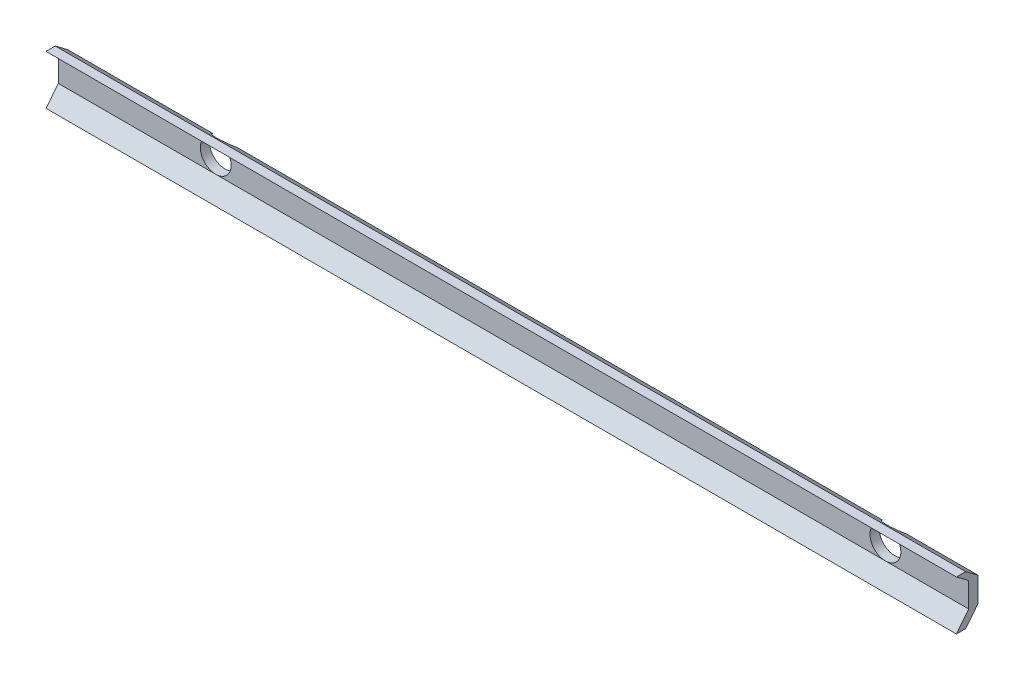
ISO-10303-21;
HEADER;
FILE_DESCRIPTION(('STEP AP214'),'2;1');
FILE_NAME('part.step','',(''),(''),'','','');
FILE_SCHEMA(('AUTOMOTIVE_DESIGN { 1 0 10303 214 1 1 1 1 }'));
ENDSEC;
DATA;
#1=APPLICATION_CONTEXT('core data for automotive mechanical design processes');
#2=APPLICATION_PROTOCOL_DEFINITION('international standard','automotive_design',2000,#1);
#3=PRODUCT_CONTEXT('',#1,'mechanical');
#4=PRODUCT('Part','Part','',(#3));
#5=PRODUCT_RELATED_PRODUCT_CATEGORY('part','',(#4));
#6=PRODUCT_DEFINITION_FORMATION('','',#4);
#7=PRODUCT_DEFINITION_CONTEXT('part definition',#1,'design');
#8=PRODUCT_DEFINITION('design','',#6,#7);
#9=PRODUCT_DEFINITION_SHAPE('','',#8);
#10=(LENGTH_UNIT() NAMED_UNIT(*) SI_UNIT(.MILLI.,.METRE.));
#11=(NAMED_UNIT(*) PLANE_ANGLE_UNIT() SI_UNIT($,.RADIAN.));
#12=(NAMED_UNIT(*) SI_UNIT($,.STERADIAN.) SOLID_ANGLE_UNIT());
#13=UNCERTAINTY_MEASURE_WITH_UNIT(LENGTH_MEASURE(1.E-05),#10,'distance_accuracy_value','');
#14=(GEOMETRIC_REPRESENTATION_CONTEXT(3) GLOBAL_UNCERTAINTY_ASSIGNED_CONTEXT((#13)) GLOBAL_UNIT_ASSIGNED_CONTEXT((#10,
#11,#12)) REPRESENTATION_CONTEXT('',''));
#15=CARTESIAN_POINT('',(0.,0.,0.));
#16=DIRECTION('',(0.,0.,1.));
#17=DIRECTION('',(1.,0.,0.));
#18=AXIS2_PLACEMENT_3D('',#15,#16,#17);
#19=CARTESIAN_POINT('',(-147.5,-1.5,-2.));
#20=DIRECTION('',(0.,0.,1.));
#21=DIRECTION('',(1.,0.,0.));
#22=AXIS2_PLACEMENT_3D('',#19,#20,#21);
#23=PLANE('',#22);
#24=CARTESIAN_POINT('',(-122.,-3.,-2.));
#25=DIRECTION('',(0.,0.,1.));
#26=DIRECTION('',(1.,0.,0.));
#27=AXIS2_PLACEMENT_3D('',#24,#25,#26);
#28=CIRCLE('',#27,2.49999999999999);
#29=CARTESIAN_POINT('',(-124.,-1.5,-2.));
#30=VERTEX_POINT('',#29);
#31=CARTESIAN_POINT('',(-122.,-5.5,-2.));
#32=VERTEX_POINT('',#31);
#33=EDGE_CURVE('E135',#30,#32,#28,.T.);
#34=ORIENTED_EDGE('',*,*,#33,.F.);
#35=DIRECTION('',(1.,0.,0.));
#36=VECTOR('',#35,1.);
#37=CARTESIAN_POINT('',(-147.5,-1.5,-2.));
#38=LINE('',#37,#36);
#39=CARTESIAN_POINT('',(-147.5,-1.5,-2.));
#40=VERTEX_POINT('',#39);
#41=EDGE_CURVE('E169',#40,#30,#38,.T.);
#42=ORIENTED_EDGE('',*,*,#41,.F.);
#43=DIRECTION('',(0.,-1.,0.));
#44=VECTOR('',#43,1.);
#45=CARTESIAN_POINT('',(-147.5,-1.5,-2.));
#46=LINE('',#45,#44);
#47=CARTESIAN_POINT('',(-147.5,-5.5,-2.));
#48=VERTEX_POINT('',#47);
#49=EDGE_CURVE('E232',#40,#48,#46,.T.);
#50=ORIENTED_EDGE('',*,*,#49,.T.);
#51=DIRECTION('',(1.,0.,0.));
#52=VECTOR('',#51,1.);
#53=CARTESIAN_POINT('',(-147.5,-5.5,-2.));
#54=LINE('',#53,#52);
#55=EDGE_CURVE('E164',#48,#32,#54,.T.);
#56=ORIENTED_EDGE('',*,*,#55,.T.);
#57=EDGE_LOOP('',(#34,#42,#50,#56));
#58=FACE_BOUND('',#57,.T.);
#59=ADVANCED_FACE('F30',(#58),#23,.T.);
#60=CARTESIAN_POINT('',(-147.5,-1.5,-3.5));
#61=DIRECTION('',(0.,0.,-1.));
#62=DIRECTION('',(0.,1.,0.));
#63=AXIS2_PLACEMENT_3D('',#60,#61,#62);
#64=PLANE('',#63);
#65=CARTESIAN_POINT('',(-122.,-3.,-3.5));
#66=DIRECTION('',(0.,0.,-1.));
#67=DIRECTION('',(0.,1.,0.));
#68=AXIS2_PLACEMENT_3D('',#65,#66,#67);
#69=CIRCLE('',#68,2.49999999999999);
#70=CARTESIAN_POINT('',(-120.,-1.5,-3.5));
#71=VERTEX_POINT('',#70);
#72=CARTESIAN_POINT('',(-122.,-5.5,-3.5));
#73=VERTEX_POINT('',#72);
#74=EDGE_CURVE('E45',#71,#73,#69,.T.);
#75=ORIENTED_EDGE('',*,*,#74,.F.);
#76=DIRECTION('',(1.,0.,0.));
#77=VECTOR('',#76,1.);
#78=CARTESIAN_POINT('',(-147.5,-1.5,-3.5));
#79=LINE('',#78,#77);
#80=CARTESIAN_POINT('',(-15.5,-1.5,-3.5));
#81=VERTEX_POINT('',#80);
#82=EDGE_CURVE('E141',#71,#81,#79,.T.);
#83=ORIENTED_EDGE('',*,*,#82,.T.);
#84=CARTESIAN_POINT('',(-13.5,-3.,-3.5));
#85=DIRECTION('',(0.,0.,-1.));
#86=DIRECTION('',(0.,1.,0.));
#87=AXIS2_PLACEMENT_3D('',#84,#85,#86);
#88=CIRCLE('',#87,2.5);
#89=CARTESIAN_POINT('',(-13.5,-5.5,-3.5));
#90=VERTEX_POINT('',#89);
#91=EDGE_CURVE('E134',#90,#81,#88,.T.);
#92=ORIENTED_EDGE('',*,*,#91,.F.);
#93=DIRECTION('',(1.,0.,0.));
#94=VECTOR('',#93,1.);
#95=CARTESIAN_POINT('',(-147.5,-5.5,-3.5));
#96=LINE('',#95,#94);
#97=EDGE_CURVE('E143',#73,#90,#96,.T.);
#98=ORIENTED_EDGE('',*,*,#97,.F.);
#99=EDGE_LOOP('',(#75,#83,#92,#98));
#100=FACE_BOUND('',#99,.T.);
#101=ADVANCED_FACE('F139',(#100),#64,.T.);
#102=CARTESIAN_POINT('',(-11.5,-1.5,-3.5));
#103=VERTEX_POINT('',#102);
#104=EDGE_CURVE('E241',#103,#90,#88,.T.);
#105=ORIENTED_EDGE('',*,*,#104,.F.);
#106=CARTESIAN_POINT('',(0.,-1.5,-3.5));
#107=VERTEX_POINT('',#106);
#108=EDGE_CURVE('E151',#103,#107,#79,.T.);
#109=ORIENTED_EDGE('',*,*,#108,.T.);
#110=DIRECTION('',(0.,1.,0.));
#111=VECTOR('',#110,1.);
#112=CARTESIAN_POINT('',(0.,-1.5,-3.5));
#113=LINE('',#112,#111);
#114=CARTESIAN_POINT('',(0.,-5.5,-3.5));
#115=VERTEX_POINT('',#114);
#116=EDGE_CURVE('E201',#115,#107,#113,.T.);
#117=ORIENTED_EDGE('',*,*,#116,.F.);
#118=EDGE_CURVE('E159',#90,#115,#96,.T.);
#119=ORIENTED_EDGE('',*,*,#118,.F.);
#120=EDGE_LOOP('',(#105,#109,#117,#119));
#121=FACE_BOUND('',#120,.T.);
#122=ADVANCED_FACE('F277',(#121),#64,.T.);
#123=CARTESIAN_POINT('',(-120.,-1.5,-2.));
#124=VERTEX_POINT('',#123);
#125=EDGE_CURVE('E52',#32,#124,#28,.T.);
#126=ORIENTED_EDGE('',*,*,#125,.F.);
#127=CARTESIAN_POINT('',(-13.5,-5.5,-2.));
#128=VERTEX_POINT('',#127);
#129=EDGE_CURVE('E167',#32,#128,#54,.T.);
#130=ORIENTED_EDGE('',*,*,#129,.T.);
#131=CARTESIAN_POINT('',(-13.5,-3.,-2.));
#132=DIRECTION('',(0.,0.,1.));
#133=DIRECTION('',(1.,0.,0.));
#134=AXIS2_PLACEMENT_3D('',#131,#132,#133);
#135=CIRCLE('',#134,2.5);
#136=CARTESIAN_POINT('',(-15.5,-1.5,-2.));
#137=VERTEX_POINT('',#136);
#138=EDGE_CURVE('E238',#137,#128,#135,.T.);
#139=ORIENTED_EDGE('',*,*,#138,.F.);
#140=EDGE_CURVE('E172',#124,#137,#38,.T.);
#141=ORIENTED_EDGE('',*,*,#140,.F.);
#142=EDGE_LOOP('',(#126,#130,#139,#141));
#143=FACE_BOUND('',#142,.T.);
#144=ADVANCED_FACE('F249',(#143),#23,.T.);
#145=CARTESIAN_POINT('',(-147.5,0.,0.));
#146=DIRECTION('',(0.,1.,0.));
#147=DIRECTION('',(0.,0.,1.));
#148=AXIS2_PLACEMENT_3D('',#145,#146,#147);
#149=PLANE('',#148);
#150=DIRECTION('',(0.,0.,1.));
#151=VECTOR('',#150,1.);
#152=CARTESIAN_POINT('',(0.,0.,0.));
#153=LINE('',#152,#151);
#154=CARTESIAN_POINT('',(0.,0.,-1.5));
#155=VERTEX_POINT('',#154);
#156=CARTESIAN_POINT('',(0.,0.,0.));
#157=VERTEX_POINT('',#156);
#158=EDGE_CURVE('E191',#155,#157,#153,.T.);
#159=ORIENTED_EDGE('',*,*,#158,.F.);
#160=DIRECTION('',(1.,0.,0.));
#161=VECTOR('',#160,1.);
#162=CARTESIAN_POINT('',(-147.5,0.,-1.5));
#163=LINE('',#162,#161);
#164=CARTESIAN_POINT('',(-147.5,0.,-1.5));
#165=VERTEX_POINT('',#164);
#166=EDGE_CURVE('E153',#165,#155,#163,.T.);
#167=ORIENTED_EDGE('',*,*,#166,.F.);
#168=DIRECTION('',(0.,0.,1.));
#169=VECTOR('',#168,1.);
#170=CARTESIAN_POINT('',(-147.5,0.,0.));
#171=LINE('',#170,#169);
#172=CARTESIAN_POINT('',(-147.5,0.,0.));
#173=VERTEX_POINT('',#172);
#174=EDGE_CURVE('E202',#165,#173,#171,.T.);
#175=ORIENTED_EDGE('',*,*,#174,.T.);
#176=DIRECTION('',(1.,0.,0.));
#177=VECTOR('',#176,1.);
#178=CARTESIAN_POINT('',(-147.5,0.,0.));
#179=LINE('',#178,#177);
#180=EDGE_CURVE('E174',#173,#157,#179,.T.);
#181=ORIENTED_EDGE('',*,*,#180,.T.);
#182=EDGE_LOOP('',(#159,#167,#175,#181));
#183=FACE_BOUND('',#182,.T.);
#184=ADVANCED_FACE('F32',(#183),#149,.T.);
#185=CARTESIAN_POINT('',(-147.5,0.,-1.5));
#186=DIRECTION('',(0.,0.8,-0.6));
#187=DIRECTION('',(0.,0.6,0.8));
#188=AXIS2_PLACEMENT_3D('',#185,#186,#187);
#189=PLANE('',#188);
#190=CARTESIAN_POINT('',(-122.,-3.,-5.5));
#191=DIRECTION('',(0.,0.8,-0.6));
#192=DIRECTION('',(0.,-0.6,-0.8));
#193=AXIS2_PLACEMENT_3D('',#190,#191,#192);
#194=ELLIPSE('',#193,4.16666666666666,2.49999999999999);
#195=CARTESIAN_POINT('',(-124.,-1.5,-3.5));
#196=VERTEX_POINT('',#195);
#197=EDGE_CURVE('E128',#196,#71,#194,.T.);
#198=ORIENTED_EDGE('',*,*,#197,.F.);
#199=CARTESIAN_POINT('',(-147.5,-1.5,-3.5));
#200=VERTEX_POINT('',#199);
#201=EDGE_CURVE('E150',#200,#196,#79,.T.);
#202=ORIENTED_EDGE('',*,*,#201,.F.);
#203=DIRECTION('',(0.,0.6,0.8));
#204=VECTOR('',#203,1.);
#205=CARTESIAN_POINT('',(-147.5,0.,-1.5));
#206=LINE('',#205,#204);
#207=EDGE_CURVE('E175',#200,#165,#206,.T.);
#208=ORIENTED_EDGE('',*,*,#207,.T.);
#209=ORIENTED_EDGE('',*,*,#166,.T.);
#210=DIRECTION('',(0.,0.6,0.8));
#211=VECTOR('',#210,1.);
#212=CARTESIAN_POINT('',(0.,0.,-1.5));
#213=LINE('',#212,#211);
#214=EDGE_CURVE('E185',#107,#155,#213,.T.);
#215=ORIENTED_EDGE('',*,*,#214,.F.);
#216=ORIENTED_EDGE('',*,*,#108,.F.);
#217=CARTESIAN_POINT('',(-13.5,-3.,-5.5));
#218=DIRECTION('',(0.,0.8,-0.6));
#219=DIRECTION('',(0.,-0.6,-0.8));
#220=AXIS2_PLACEMENT_3D('',#217,#218,#219);
#221=ELLIPSE('',#220,4.16666666666667,2.5);
#222=EDGE_CURVE('E149',#81,#103,#221,.T.);
#223=ORIENTED_EDGE('',*,*,#222,.F.);
#224=ORIENTED_EDGE('',*,*,#82,.F.);
#225=EDGE_LOOP('',(#198,#202,#208,#209,#215,#216,#223,#224));
#226=FACE_BOUND('',#225,.T.);
#227=ADVANCED_FACE('F147',(#226),#189,.T.);
#228=EDGE_CURVE('E130',#73,#196,#69,.T.);
#229=ORIENTED_EDGE('',*,*,#228,.F.);
#230=CARTESIAN_POINT('',(-147.5,-5.5,-3.5));
#231=VERTEX_POINT('',#230);
#232=EDGE_CURVE('E154',#231,#73,#96,.T.);
#233=ORIENTED_EDGE('',*,*,#232,.F.);
#234=DIRECTION('',(0.,1.,0.));
#235=VECTOR('',#234,1.);
#236=CARTESIAN_POINT('',(-147.5,-1.5,-3.5));
#237=LINE('',#236,#235);
#238=EDGE_CURVE('E220',#231,#200,#237,.T.);
#239=ORIENTED_EDGE('',*,*,#238,.T.);
#240=ORIENTED_EDGE('',*,*,#201,.T.);
#241=EDGE_LOOP('',(#229,#233,#239,#240));
#242=FACE_BOUND('',#241,.T.);
#243=ADVANCED_FACE('F295',(#242),#64,.T.);
#244=CARTESIAN_POINT('',(-147.5,-5.5,-3.5));
#245=DIRECTION('',(0.,-0.624695047554425,-0.78086880944303));
#246=DIRECTION('',(0.,0.78086880944303,-0.624695047554425));
#247=AXIS2_PLACEMENT_3D('',#244,#245,#246);
#248=PLANE('',#247);
#249=DIRECTION('',(0.,0.78086880944303,-0.624695047554425));
#250=VECTOR('',#249,1.);
#251=CARTESIAN_POINT('',(0.,-5.5,-3.5));
#252=LINE('',#251,#250);
#253=CARTESIAN_POINT('',(0.,-8.,-1.5));
#254=VERTEX_POINT('',#253);
#255=EDGE_CURVE('E205',#254,#115,#252,.T.);
#256=ORIENTED_EDGE('',*,*,#255,.F.);
#257=DIRECTION('',(1.,0.,0.));
#258=VECTOR('',#257,1.);
#259=CARTESIAN_POINT('',(-147.5,-8.,-1.5));
#260=LINE('',#259,#258);
#261=CARTESIAN_POINT('',(-147.5,-8.,-1.5));
#262=VERTEX_POINT('',#261);
#263=EDGE_CURVE('E160',#262,#254,#260,.T.);
#264=ORIENTED_EDGE('',*,*,#263,.F.);
#265=DIRECTION('',(0.,0.78086880944303,-0.624695047554425));
#266=VECTOR('',#265,1.);
#267=CARTESIAN_POINT('',(-147.5,-5.5,-3.5));
#268=LINE('',#267,#266);
#269=EDGE_CURVE('E223',#262,#231,#268,.T.);
#270=ORIENTED_EDGE('',*,*,#269,.T.);
#271=ORIENTED_EDGE('',*,*,#232,.T.);
#272=ORIENTED_EDGE('',*,*,#97,.T.);
#273=ORIENTED_EDGE('',*,*,#118,.T.);
#274=EDGE_LOOP('',(#256,#264,#270,#271,#272,#273));
#275=FACE_BOUND('',#274,.T.);
#276=ADVANCED_FACE('F272',(#275),#248,.T.);
#277=CARTESIAN_POINT('',(-147.5,-8.,0.));
#278=DIRECTION('',(0.,-1.,0.));
#279=DIRECTION('',(0.,0.,-1.));
#280=AXIS2_PLACEMENT_3D('',#277,#278,#279);
#281=PLANE('',#280);
#282=DIRECTION('',(0.,0.,-1.));
#283=VECTOR('',#282,1.);
#284=CARTESIAN_POINT('',(0.,-8.,0.));
#285=LINE('',#284,#283);
#286=CARTESIAN_POINT('',(0.,-8.,0.));
#287=VERTEX_POINT('',#286);
#288=EDGE_CURVE('E209',#287,#254,#285,.T.);
#289=ORIENTED_EDGE('',*,*,#288,.F.);
#290=DIRECTION('',(1.,0.,0.));
#291=VECTOR('',#290,1.);
#292=CARTESIAN_POINT('',(-147.5,-8.,0.));
#293=LINE('',#292,#291);
#294=CARTESIAN_POINT('',(-147.5,-8.,0.));
#295=VERTEX_POINT('',#294);
#296=EDGE_CURVE('E162',#295,#287,#293,.T.);
#297=ORIENTED_EDGE('',*,*,#296,.F.);
#298=DIRECTION('',(0.,0.,-1.));
#299=VECTOR('',#298,1.);
#300=CARTESIAN_POINT('',(-147.5,-8.,0.));
#301=LINE('',#300,#299);
#302=EDGE_CURVE('E226',#295,#262,#301,.T.);
#303=ORIENTED_EDGE('',*,*,#302,.T.);
#304=ORIENTED_EDGE('',*,*,#263,.T.);
#305=EDGE_LOOP('',(#289,#297,#303,#304));
#306=FACE_BOUND('',#305,.T.);
#307=ADVANCED_FACE('F269',(#306),#281,.T.);
#308=CARTESIAN_POINT('',(-147.5,-5.5,-2.));
#309=DIRECTION('',(0.,0.624695047554425,0.78086880944303));
#310=DIRECTION('',(0.,-0.78086880944303,0.624695047554425));
#311=AXIS2_PLACEMENT_3D('',#308,#309,#310);
#312=PLANE('',#311);
#313=DIRECTION('',(0.,-0.78086880944303,0.624695047554425));
#314=VECTOR('',#313,1.);
#315=CARTESIAN_POINT('',(0.,-5.5,-2.));
#316=LINE('',#315,#314);
#317=CARTESIAN_POINT('',(0.,-5.5,-2.));
#318=VERTEX_POINT('',#317);
#319=EDGE_CURVE('E212',#318,#287,#316,.T.);
#320=ORIENTED_EDGE('',*,*,#319,.F.);
#321=EDGE_CURVE('E168',#128,#318,#54,.T.);
#322=ORIENTED_EDGE('',*,*,#321,.F.);
#323=ORIENTED_EDGE('',*,*,#129,.F.);
#324=ORIENTED_EDGE('',*,*,#55,.F.);
#325=DIRECTION('',(0.,-0.78086880944303,0.624695047554425));
#326=VECTOR('',#325,1.);
#327=CARTESIAN_POINT('',(-147.5,-5.5,-2.));
#328=LINE('',#327,#326);
#329=EDGE_CURVE('E229',#48,#295,#328,.T.);
#330=ORIENTED_EDGE('',*,*,#329,.T.);
#331=ORIENTED_EDGE('',*,*,#296,.T.);
#332=EDGE_LOOP('',(#320,#322,#323,#324,#330,#331));
#333=FACE_BOUND('',#332,.T.);
#334=ADVANCED_FACE('F253',(#333),#312,.T.);
#335=CARTESIAN_POINT('',(-11.5,-1.5,-2.));
#336=VERTEX_POINT('',#335);
#337=EDGE_CURVE('E239',#128,#336,#135,.T.);
#338=ORIENTED_EDGE('',*,*,#337,.F.);
#339=ORIENTED_EDGE('',*,*,#321,.T.);
#340=DIRECTION('',(0.,-1.,0.));
#341=VECTOR('',#340,1.);
#342=CARTESIAN_POINT('',(0.,-1.5,-2.));
#343=LINE('',#342,#341);
#344=CARTESIAN_POINT('',(0.,-1.5,-2.));
#345=VERTEX_POINT('',#344);
#346=EDGE_CURVE('E215',#345,#318,#343,.T.);
#347=ORIENTED_EDGE('',*,*,#346,.F.);
#348=EDGE_CURVE('E173',#336,#345,#38,.T.);
#349=ORIENTED_EDGE('',*,*,#348,.F.);
#350=EDGE_LOOP('',(#338,#339,#347,#349));
#351=FACE_BOUND('',#350,.T.);
#352=ADVANCED_FACE('F266',(#351),#23,.T.);
#353=CARTESIAN_POINT('',(-147.5,0.,0.));
#354=DIRECTION('',(0.,-0.8,0.6));
#355=DIRECTION('',(0.,-0.6,-0.8));
#356=AXIS2_PLACEMENT_3D('',#353,#354,#355);
#357=PLANE('',#356);
#358=CARTESIAN_POINT('',(-122.,-3.,-4.00000000000001));
#359=DIRECTION('',(0.,-0.8,0.6));
#360=DIRECTION('',(0.,-0.6,-0.8));
#361=AXIS2_PLACEMENT_3D('',#358,#359,#360);
#362=ELLIPSE('',#361,4.16666666666666,2.49999999999999);
#363=EDGE_CURVE('E11',#124,#30,#362,.T.);
#364=ORIENTED_EDGE('',*,*,#363,.F.);
#365=ORIENTED_EDGE('',*,*,#140,.T.);
#366=CARTESIAN_POINT('',(-13.5,-3.,-4.00000000000001));
#367=DIRECTION('',(0.,-0.8,0.6));
#368=DIRECTION('',(0.,-0.6,-0.8));
#369=AXIS2_PLACEMENT_3D('',#366,#367,#368);
#370=ELLIPSE('',#369,4.16666666666667,2.5);
#371=EDGE_CURVE('E38',#336,#137,#370,.T.);
#372=ORIENTED_EDGE('',*,*,#371,.F.);
#373=ORIENTED_EDGE('',*,*,#348,.T.);
#374=DIRECTION('',(0.,-0.6,-0.8));
#375=VECTOR('',#374,1.);
#376=CARTESIAN_POINT('',(0.,0.,0.));
#377=LINE('',#376,#375);
#378=EDGE_CURVE('E195',#157,#345,#377,.T.);
#379=ORIENTED_EDGE('',*,*,#378,.F.);
#380=ORIENTED_EDGE('',*,*,#180,.F.);
#381=DIRECTION('',(0.,-0.6,-0.8));
#382=VECTOR('',#381,1.);
#383=CARTESIAN_POINT('',(-147.5,0.,0.));
#384=LINE('',#383,#382);
#385=EDGE_CURVE('E203',#173,#40,#384,.T.);
#386=ORIENTED_EDGE('',*,*,#385,.T.);
#387=ORIENTED_EDGE('',*,*,#41,.T.);
#388=EDGE_LOOP('',(#364,#365,#372,#373,#379,#380,#386,#387));
#389=FACE_BOUND('',#388,.T.);
#390=ADVANCED_FACE('F261',(#389),#357,.T.);
#391=CARTESIAN_POINT('',(-147.5,0.,-3.5));
#392=DIRECTION('',(-1.,0.,0.));
#393=DIRECTION('',(0.,0.,1.));
#394=AXIS2_PLACEMENT_3D('',#391,#392,#393);
#395=PLANE('',#394);
#396=ORIENTED_EDGE('',*,*,#174,.F.);
#397=ORIENTED_EDGE('',*,*,#207,.F.);
#398=ORIENTED_EDGE('',*,*,#238,.F.);
#399=ORIENTED_EDGE('',*,*,#269,.F.);
#400=ORIENTED_EDGE('',*,*,#302,.F.);
#401=ORIENTED_EDGE('',*,*,#329,.F.);
#402=ORIENTED_EDGE('',*,*,#49,.F.);
#403=ORIENTED_EDGE('',*,*,#385,.F.);
#404=EDGE_LOOP('',(#396,#397,#398,#399,#400,#401,#402,#403));
#405=FACE_BOUND('',#404,.T.);
#406=ADVANCED_FACE('F258',(#405),#395,.T.);
#407=CARTESIAN_POINT('',(0.,0.,-3.5));
#408=DIRECTION('',(-1.,0.,0.));
#409=DIRECTION('',(0.,0.,1.));
#410=AXIS2_PLACEMENT_3D('',#407,#408,#409);
#411=PLANE('',#410);
#412=ORIENTED_EDGE('',*,*,#158,.T.);
#413=ORIENTED_EDGE('',*,*,#378,.T.);
#414=ORIENTED_EDGE('',*,*,#346,.T.);
#415=ORIENTED_EDGE('',*,*,#319,.T.);
#416=ORIENTED_EDGE('',*,*,#288,.T.);
#417=ORIENTED_EDGE('',*,*,#255,.T.);
#418=ORIENTED_EDGE('',*,*,#116,.T.);
#419=ORIENTED_EDGE('',*,*,#214,.T.);
#420=EDGE_LOOP('',(#412,#413,#414,#415,#416,#417,#418,#419));
#421=FACE_BOUND('',#420,.T.);
#422=ADVANCED_FACE('F198',(#421),#411,.F.);
#423=CARTESIAN_POINT('',(-13.5,-3.,0.));
#424=DIRECTION('',(0.,0.,-1.));
#425=DIRECTION('',(0.,1.,0.));
#426=AXIS2_PLACEMENT_3D('',#423,#424,#425);
#427=CYLINDRICAL_SURFACE('',#426,2.5);
#428=ORIENTED_EDGE('',*,*,#222,.T.);
#429=ORIENTED_EDGE('',*,*,#104,.T.);
#430=ORIENTED_EDGE('',*,*,#91,.T.);
#431=EDGE_LOOP('',(#428,#429,#430));
#432=FACE_BOUND('',#431,.T.);
#433=ORIENTED_EDGE('',*,*,#138,.T.);
#434=ORIENTED_EDGE('',*,*,#337,.T.);
#435=ORIENTED_EDGE('',*,*,#371,.T.);
#436=EDGE_LOOP('',(#433,#434,#435));
#437=FACE_BOUND('',#436,.T.);
#438=ADVANCED_FACE('F279',(#432,#437),#427,.F.);
#439=CARTESIAN_POINT('',(-122.,-3.,0.));
#440=DIRECTION('',(0.,0.,-1.));
#441=DIRECTION('',(0.,1.,0.));
#442=AXIS2_PLACEMENT_3D('',#439,#440,#441);
#443=CYLINDRICAL_SURFACE('',#442,2.49999999999999);
#444=ORIENTED_EDGE('',*,*,#197,.T.);
#445=ORIENTED_EDGE('',*,*,#74,.T.);
#446=ORIENTED_EDGE('',*,*,#228,.T.);
#447=EDGE_LOOP('',(#444,#445,#446));
#448=FACE_BOUND('',#447,.T.);
#449=ORIENTED_EDGE('',*,*,#33,.T.);
#450=ORIENTED_EDGE('',*,*,#125,.T.);
#451=ORIENTED_EDGE('',*,*,#363,.T.);
#452=EDGE_LOOP('',(#449,#450,#451));
#453=FACE_BOUND('',#452,.T.);
#454=ADVANCED_FACE('F129',(#448,#453),#443,.F.);
#455=CLOSED_SHELL('',(#59,#101,#122,#144,#184,#227,#243,#276,#307,#334,#352,#390,#406,#422,#438,#454));
#456=MANIFOLD_SOLID_BREP('B2',#455);
#457=ADVANCED_BREP_SHAPE_REPRESENTATION('',(#18,#456),#14);
#458=SHAPE_DEFINITION_REPRESENTATION(#9,#457);
ENDSEC;
END-ISO-10303-21;
